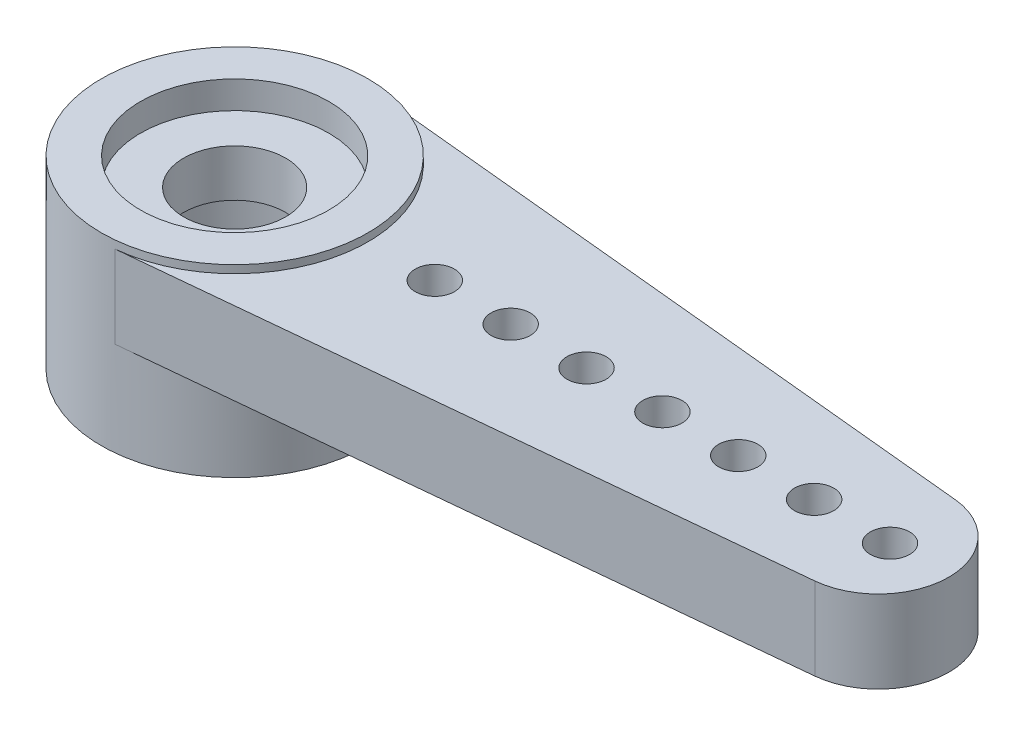
ISO-10303-21;
HEADER;
FILE_DESCRIPTION(('STEP AP214'),'2;1');
FILE_NAME('part.step','',(''),(''),'','','');
FILE_SCHEMA(('AUTOMOTIVE_DESIGN { 1 0 10303 214 1 1 1 1 }'));
ENDSEC;
DATA;
#1=APPLICATION_CONTEXT('core data for automotive mechanical design processes');
#2=APPLICATION_PROTOCOL_DEFINITION('international standard','automotive_design',2000,#1);
#3=PRODUCT_CONTEXT('',#1,'mechanical');
#4=PRODUCT('Part','Part','',(#3));
#5=PRODUCT_RELATED_PRODUCT_CATEGORY('part','',(#4));
#6=PRODUCT_DEFINITION_FORMATION('','',#4);
#7=PRODUCT_DEFINITION_CONTEXT('part definition',#1,'design');
#8=PRODUCT_DEFINITION('design','',#6,#7);
#9=PRODUCT_DEFINITION_SHAPE('','',#8);
#10=(LENGTH_UNIT() NAMED_UNIT(*) SI_UNIT(.MILLI.,.METRE.));
#11=(NAMED_UNIT(*) PLANE_ANGLE_UNIT() SI_UNIT($,.RADIAN.));
#12=(NAMED_UNIT(*) SI_UNIT($,.STERADIAN.) SOLID_ANGLE_UNIT());
#13=UNCERTAINTY_MEASURE_WITH_UNIT(LENGTH_MEASURE(1.E-05),#10,'distance_accuracy_value','');
#14=(GEOMETRIC_REPRESENTATION_CONTEXT(3) GLOBAL_UNCERTAINTY_ASSIGNED_CONTEXT((#13)) GLOBAL_UNIT_ASSIGNED_CONTEXT((#10,
#11,#12)) REPRESENTATION_CONTEXT('',''));
#15=CARTESIAN_POINT('',(0.,0.,0.));
#16=DIRECTION('',(0.,0.,1.));
#17=DIRECTION('',(1.,0.,0.));
#18=AXIS2_PLACEMENT_3D('',#15,#16,#17);
#19=CARTESIAN_POINT('',(30.,-0.200000000000001,0.));
#20=DIRECTION('',(0.,-1.,0.));
#21=DIRECTION('',(0.,0.,-1.));
#22=AXIS2_PLACEMENT_3D('',#19,#20,#21);
#23=PLANE('',#22);
#24=CARTESIAN_POINT('',(40.9,-0.200000000000001,0.));
#25=DIRECTION('',(0.,-1.,0.));
#26=DIRECTION('',(0.,0.,-1.));
#27=AXIS2_PLACEMENT_3D('',#24,#25,#26);
#28=CIRCLE('',#27,0.499999999999987);
#29=CARTESIAN_POINT('',(40.9,-0.200000000000001,-0.499999999999987));
#30=VERTEX_POINT('',#29);
#31=EDGE_CURVE('E214',#30,#30,#28,.T.);
#32=ORIENTED_EDGE('',*,*,#31,.T.);
#33=EDGE_LOOP('',(#32));
#34=FACE_BOUND('',#33,.T.);
#35=CARTESIAN_POINT('',(42.8333333333333,-0.200000000000001,0.));
#36=DIRECTION('',(0.,-1.,0.));
#37=DIRECTION('',(0.,0.,-1.));
#38=AXIS2_PLACEMENT_3D('',#35,#36,#37);
#39=CIRCLE('',#38,0.499999999999987);
#40=CARTESIAN_POINT('',(42.8333333333333,-0.200000000000001,-0.499999999999987));
#41=VERTEX_POINT('',#40);
#42=EDGE_CURVE('E208',#41,#41,#39,.T.);
#43=ORIENTED_EDGE('',*,*,#42,.T.);
#44=EDGE_LOOP('',(#43));
#45=FACE_BOUND('',#44,.T.);
#46=CARTESIAN_POINT('',(37.0333333333333,-0.200000000000001,0.));
#47=DIRECTION('',(0.,-1.,0.));
#48=DIRECTION('',(0.,0.,-1.));
#49=AXIS2_PLACEMENT_3D('',#46,#47,#48);
#50=CIRCLE('',#49,0.499999999999987);
#51=CARTESIAN_POINT('',(37.0333333333333,-0.200000000000001,-0.499999999999987));
#52=VERTEX_POINT('',#51);
#53=EDGE_CURVE('E202',#52,#52,#50,.T.);
#54=ORIENTED_EDGE('',*,*,#53,.T.);
#55=EDGE_LOOP('',(#54));
#56=FACE_BOUND('',#55,.T.);
#57=CARTESIAN_POINT('',(46.7,-0.200000000000001,0.));
#58=DIRECTION('',(0.,-1.,0.));
#59=DIRECTION('',(0.,0.,-1.));
#60=AXIS2_PLACEMENT_3D('',#57,#58,#59);
#61=CIRCLE('',#60,0.499999999999987);
#62=CARTESIAN_POINT('',(46.7,-0.200000000000001,-0.499999999999987));
#63=VERTEX_POINT('',#62);
#64=EDGE_CURVE('E196',#63,#63,#61,.T.);
#65=ORIENTED_EDGE('',*,*,#64,.T.);
#66=EDGE_LOOP('',(#65));
#67=FACE_BOUND('',#66,.T.);
#68=CARTESIAN_POINT('',(38.9666666666667,-0.200000000000001,0.));
#69=DIRECTION('',(0.,-1.,0.));
#70=DIRECTION('',(0.,0.,-1.));
#71=AXIS2_PLACEMENT_3D('',#68,#69,#70);
#72=CIRCLE('',#71,0.499999999999987);
#73=CARTESIAN_POINT('',(38.9666666666667,-0.200000000000001,-0.499999999999987));
#74=VERTEX_POINT('',#73);
#75=EDGE_CURVE('E190',#74,#74,#72,.T.);
#76=ORIENTED_EDGE('',*,*,#75,.T.);
#77=EDGE_LOOP('',(#76));
#78=FACE_BOUND('',#77,.T.);
#79=CARTESIAN_POINT('',(44.7666666666667,-0.200000000000001,0.));
#80=DIRECTION('',(0.,-1.,0.));
#81=DIRECTION('',(0.,0.,-1.));
#82=AXIS2_PLACEMENT_3D('',#79,#80,#81);
#83=CIRCLE('',#82,0.499999999999987);
#84=CARTESIAN_POINT('',(44.7666666666667,-0.200000000000001,-0.499999999999987));
#85=VERTEX_POINT('',#84);
#86=EDGE_CURVE('E184',#85,#85,#83,.T.);
#87=ORIENTED_EDGE('',*,*,#86,.T.);
#88=EDGE_LOOP('',(#87));
#89=FACE_BOUND('',#88,.T.);
#90=CARTESIAN_POINT('',(35.1,-0.200000000000001,0.));
#91=DIRECTION('',(0.,-1.,0.));
#92=DIRECTION('',(0.,0.,-1.));
#93=AXIS2_PLACEMENT_3D('',#90,#91,#92);
#94=CIRCLE('',#93,0.499999999999987);
#95=CARTESIAN_POINT('',(35.1,-0.200000000000001,-0.499999999999987));
#96=VERTEX_POINT('',#95);
#97=EDGE_CURVE('E178',#96,#96,#94,.T.);
#98=ORIENTED_EDGE('',*,*,#97,.T.);
#99=EDGE_LOOP('',(#98));
#100=FACE_BOUND('',#99,.T.);
#101=CARTESIAN_POINT('',(30.,-0.200000000000001,0.));
#102=DIRECTION('',(0.,1.,0.));
#103=DIRECTION('',(0.,0.,1.));
#104=AXIS2_PLACEMENT_3D('',#101,#102,#103);
#105=CIRCLE('',#104,3.4);
#106=CARTESIAN_POINT('',(30.3317073170732,-0.200000000000001,3.38378046802687));
#107=VERTEX_POINT('',#106);
#108=CARTESIAN_POINT('',(30.3317073170732,-0.200000000000001,-3.38378046802704));
#109=VERTEX_POINT('',#108);
#110=EDGE_CURVE('E90',#107,#109,#105,.T.);
#111=ORIENTED_EDGE('',*,*,#110,.F.);
#112=DIRECTION('',(0.995229549419667,0.,-0.0975609756097504));
#113=VECTOR('',#112,1.);
#114=CARTESIAN_POINT('',(46.5756097560976,-0.200000000000001,1.79141318895549));
#115=LINE('',#114,#113);
#116=CARTESIAN_POINT('',(46.5756097560976,-0.200000000000001,1.79141318895554));
#117=VERTEX_POINT('',#116);
#118=EDGE_CURVE('E83',#107,#117,#115,.T.);
#119=ORIENTED_EDGE('',*,*,#118,.T.);
#120=CARTESIAN_POINT('',(46.4,-0.200000000000001,0.));
#121=DIRECTION('',(0.,1.,0.));
#122=DIRECTION('',(0.,0.,-1.));
#123=AXIS2_PLACEMENT_3D('',#120,#121,#122);
#124=CIRCLE('',#123,1.80000000000014);
#125=CARTESIAN_POINT('',(46.5756097560976,-0.200000000000001,-1.79141318895558));
#126=VERTEX_POINT('',#125);
#127=EDGE_CURVE('E97',#117,#126,#124,.T.);
#128=ORIENTED_EDGE('',*,*,#127,.T.);
#129=DIRECTION('',(-0.995229549419667,0.,-0.0975609756097555));
#130=VECTOR('',#129,1.);
#131=CARTESIAN_POINT('',(30.3317073170732,-0.200000000000001,-3.38378046802704));
#132=LINE('',#131,#130);
#133=EDGE_CURVE('E62',#126,#109,#132,.T.);
#134=ORIENTED_EDGE('',*,*,#133,.T.);
#135=EDGE_LOOP('',(#111,#119,#128,#134));
#136=FACE_BOUND('',#135,.T.);
#137=ADVANCED_FACE('F39',(#34,#45,#56,#67,#78,#89,#100,#136),#23,.F.);
#138=CARTESIAN_POINT('',(30.,-2.3,0.));
#139=DIRECTION('',(0.,-1.,0.));
#140=DIRECTION('',(0.,0.,-1.));
#141=AXIS2_PLACEMENT_3D('',#138,#139,#140);
#142=CYLINDRICAL_SURFACE('',#141,3.4);
#143=CARTESIAN_POINT('',(30.,-2.3,0.));
#144=DIRECTION('',(0.,-1.,0.));
#145=DIRECTION('',(0.,0.,-1.));
#146=AXIS2_PLACEMENT_3D('',#143,#144,#145);
#147=CIRCLE('',#146,3.4);
#148=CARTESIAN_POINT('',(30.3317073170732,-2.3,-3.38378046802704));
#149=VERTEX_POINT('',#148);
#150=CARTESIAN_POINT('',(30.3317073170732,-2.3,3.38378046802687));
#151=VERTEX_POINT('',#150);
#152=EDGE_CURVE('E11',#149,#151,#147,.T.);
#153=ORIENTED_EDGE('',*,*,#152,.T.);
#154=DIRECTION('',(0.,-1.,0.));
#155=VECTOR('',#154,1.);
#156=CARTESIAN_POINT('',(30.3317073170732,-0.200000000000001,3.38378046802687));
#157=LINE('',#156,#155);
#158=EDGE_CURVE('E88',#107,#151,#157,.T.);
#159=ORIENTED_EDGE('',*,*,#158,.F.);
#160=ORIENTED_EDGE('',*,*,#110,.T.);
#161=DIRECTION('',(0.,-1.,0.));
#162=VECTOR('',#161,1.);
#163=CARTESIAN_POINT('',(30.3317073170732,-0.200000000000001,-3.38378046802704));
#164=LINE('',#163,#162);
#165=EDGE_CURVE('E53',#109,#149,#164,.T.);
#166=ORIENTED_EDGE('',*,*,#165,.T.);
#167=EDGE_LOOP('',(#153,#159,#160,#166));
#168=FACE_BOUND('',#167,.T.);
#169=CARTESIAN_POINT('',(30.,-4.7,0.));
#170=DIRECTION('',(0.,-1.,0.));
#171=DIRECTION('',(0.,0.,-1.));
#172=AXIS2_PLACEMENT_3D('',#169,#170,#171);
#173=CIRCLE('',#172,3.4);
#174=CARTESIAN_POINT('',(30.,-4.7,-3.4));
#175=VERTEX_POINT('',#174);
#176=EDGE_CURVE('E47',#175,#175,#173,.T.);
#177=ORIENTED_EDGE('',*,*,#176,.F.);
#178=EDGE_LOOP('',(#177));
#179=FACE_BOUND('',#178,.T.);
#180=CARTESIAN_POINT('',(30.,0.,0.));
#181=DIRECTION('',(0.,1.,0.));
#182=DIRECTION('',(0.,0.,1.));
#183=AXIS2_PLACEMENT_3D('',#180,#181,#182);
#184=CIRCLE('',#183,3.4);
#185=CARTESIAN_POINT('',(30.,0.,3.4));
#186=VERTEX_POINT('',#185);
#187=EDGE_CURVE('E100',#186,#186,#184,.T.);
#188=ORIENTED_EDGE('',*,*,#187,.F.);
#189=EDGE_LOOP('',(#188));
#190=FACE_BOUND('',#189,.T.);
#191=ADVANCED_FACE('F41',(#168,#179,#190),#142,.T.);
#192=CARTESIAN_POINT('',(30.,-4.7,0.));
#193=DIRECTION('',(0.,-1.,0.));
#194=DIRECTION('',(0.,0.,-1.));
#195=AXIS2_PLACEMENT_3D('',#192,#193,#194);
#196=PLANE('',#195);
#197=CARTESIAN_POINT('',(30.,-4.7,0.));
#198=DIRECTION('',(0.,-1.,0.));
#199=DIRECTION('',(0.,0.,-1.));
#200=AXIS2_PLACEMENT_3D('',#197,#198,#199);
#201=CIRCLE('',#200,2.4);
#202=CARTESIAN_POINT('',(30.,-4.7,-2.4));
#203=VERTEX_POINT('',#202);
#204=EDGE_CURVE('E107',#203,#203,#201,.T.);
#205=ORIENTED_EDGE('',*,*,#204,.F.);
#206=EDGE_LOOP('',(#205));
#207=FACE_BOUND('',#206,.T.);
#208=ORIENTED_EDGE('',*,*,#176,.T.);
#209=EDGE_LOOP('',(#208));
#210=FACE_BOUND('',#209,.T.);
#211=ADVANCED_FACE('F121',(#207,#210),#196,.T.);
#212=CARTESIAN_POINT('',(30.,-2.3,0.));
#213=DIRECTION('',(0.,-1.,0.));
#214=DIRECTION('',(0.,0.,-1.));
#215=AXIS2_PLACEMENT_3D('',#212,#213,#214);
#216=PLANE('',#215);
#217=CARTESIAN_POINT('',(40.9,-2.3,0.));
#218=DIRECTION('',(0.,-1.,0.));
#219=DIRECTION('',(0.,0.,-1.));
#220=AXIS2_PLACEMENT_3D('',#217,#218,#219);
#221=CIRCLE('',#220,0.499999999999987);
#222=CARTESIAN_POINT('',(40.9,-2.3,-0.499999999999987));
#223=VERTEX_POINT('',#222);
#224=EDGE_CURVE('E216',#223,#223,#221,.T.);
#225=ORIENTED_EDGE('',*,*,#224,.F.);
#226=EDGE_LOOP('',(#225));
#227=FACE_BOUND('',#226,.T.);
#228=CARTESIAN_POINT('',(42.8333333333333,-2.3,0.));
#229=DIRECTION('',(0.,-1.,0.));
#230=DIRECTION('',(0.,0.,-1.));
#231=AXIS2_PLACEMENT_3D('',#228,#229,#230);
#232=CIRCLE('',#231,0.499999999999987);
#233=CARTESIAN_POINT('',(42.8333333333333,-2.3,-0.499999999999987));
#234=VERTEX_POINT('',#233);
#235=EDGE_CURVE('E211',#234,#234,#232,.T.);
#236=ORIENTED_EDGE('',*,*,#235,.F.);
#237=EDGE_LOOP('',(#236));
#238=FACE_BOUND('',#237,.T.);
#239=CARTESIAN_POINT('',(37.0333333333333,-2.3,0.));
#240=DIRECTION('',(0.,-1.,0.));
#241=DIRECTION('',(0.,0.,-1.));
#242=AXIS2_PLACEMENT_3D('',#239,#240,#241);
#243=CIRCLE('',#242,0.499999999999987);
#244=CARTESIAN_POINT('',(37.0333333333333,-2.3,-0.499999999999987));
#245=VERTEX_POINT('',#244);
#246=EDGE_CURVE('E205',#245,#245,#243,.T.);
#247=ORIENTED_EDGE('',*,*,#246,.F.);
#248=EDGE_LOOP('',(#247));
#249=FACE_BOUND('',#248,.T.);
#250=CARTESIAN_POINT('',(46.7,-2.3,0.));
#251=DIRECTION('',(0.,-1.,0.));
#252=DIRECTION('',(0.,0.,-1.));
#253=AXIS2_PLACEMENT_3D('',#250,#251,#252);
#254=CIRCLE('',#253,0.499999999999987);
#255=CARTESIAN_POINT('',(46.7,-2.3,-0.499999999999987));
#256=VERTEX_POINT('',#255);
#257=EDGE_CURVE('E199',#256,#256,#254,.T.);
#258=ORIENTED_EDGE('',*,*,#257,.F.);
#259=EDGE_LOOP('',(#258));
#260=FACE_BOUND('',#259,.T.);
#261=CARTESIAN_POINT('',(38.9666666666667,-2.3,0.));
#262=DIRECTION('',(0.,-1.,0.));
#263=DIRECTION('',(0.,0.,-1.));
#264=AXIS2_PLACEMENT_3D('',#261,#262,#263);
#265=CIRCLE('',#264,0.499999999999987);
#266=CARTESIAN_POINT('',(38.9666666666667,-2.3,-0.499999999999987));
#267=VERTEX_POINT('',#266);
#268=EDGE_CURVE('E193',#267,#267,#265,.T.);
#269=ORIENTED_EDGE('',*,*,#268,.F.);
#270=EDGE_LOOP('',(#269));
#271=FACE_BOUND('',#270,.T.);
#272=CARTESIAN_POINT('',(44.7666666666667,-2.3,0.));
#273=DIRECTION('',(0.,-1.,0.));
#274=DIRECTION('',(0.,0.,-1.));
#275=AXIS2_PLACEMENT_3D('',#272,#273,#274);
#276=CIRCLE('',#275,0.499999999999987);
#277=CARTESIAN_POINT('',(44.7666666666667,-2.3,-0.499999999999987));
#278=VERTEX_POINT('',#277);
#279=EDGE_CURVE('E187',#278,#278,#276,.T.);
#280=ORIENTED_EDGE('',*,*,#279,.F.);
#281=EDGE_LOOP('',(#280));
#282=FACE_BOUND('',#281,.T.);
#283=CARTESIAN_POINT('',(35.1,-2.3,0.));
#284=DIRECTION('',(0.,-1.,0.));
#285=DIRECTION('',(0.,0.,-1.));
#286=AXIS2_PLACEMENT_3D('',#283,#284,#285);
#287=CIRCLE('',#286,0.499999999999987);
#288=CARTESIAN_POINT('',(35.1,-2.3,-0.499999999999987));
#289=VERTEX_POINT('',#288);
#290=EDGE_CURVE('E181',#289,#289,#287,.T.);
#291=ORIENTED_EDGE('',*,*,#290,.F.);
#292=EDGE_LOOP('',(#291));
#293=FACE_BOUND('',#292,.T.);
#294=ORIENTED_EDGE('',*,*,#152,.F.);
#295=DIRECTION('',(-0.995229549419667,0.,-0.0975609756097555));
#296=VECTOR('',#295,1.);
#297=CARTESIAN_POINT('',(30.3317073170732,-2.3,-3.38378046802704));
#298=LINE('',#297,#296);
#299=CARTESIAN_POINT('',(46.5756097560976,-2.3,-1.79141318895558));
#300=VERTEX_POINT('',#299);
#301=EDGE_CURVE('E98',#300,#149,#298,.T.);
#302=ORIENTED_EDGE('',*,*,#301,.F.);
#303=CARTESIAN_POINT('',(46.4,-2.3,0.));
#304=DIRECTION('',(0.,1.,0.));
#305=DIRECTION('',(0.,0.,-1.));
#306=AXIS2_PLACEMENT_3D('',#303,#304,#305);
#307=CIRCLE('',#306,1.80000000000014);
#308=CARTESIAN_POINT('',(46.5756097560976,-2.3,1.79141318895554));
#309=VERTEX_POINT('',#308);
#310=EDGE_CURVE('E79',#309,#300,#307,.T.);
#311=ORIENTED_EDGE('',*,*,#310,.F.);
#312=DIRECTION('',(0.995229549419667,0.,-0.0975609756097504));
#313=VECTOR('',#312,1.);
#314=CARTESIAN_POINT('',(46.5756097560976,-2.3,1.79141318895549));
#315=LINE('',#314,#313);
#316=EDGE_CURVE('E104',#151,#309,#315,.T.);
#317=ORIENTED_EDGE('',*,*,#316,.F.);
#318=EDGE_LOOP('',(#294,#302,#311,#317));
#319=FACE_BOUND('',#318,.T.);
#320=ADVANCED_FACE('F150',(#227,#238,#249,#260,#271,#282,#293,#319),#216,.T.);
#321=CARTESIAN_POINT('',(46.5756097560976,-0.200000000000001,1.79141318895549));
#322=DIRECTION('',(-0.0975609756097504,0.,-0.995229549419667));
#323=DIRECTION('',(-0.995229549419667,0.,0.0975609756097504));
#324=AXIS2_PLACEMENT_3D('',#321,#322,#323);
#325=PLANE('',#324);
#326=ORIENTED_EDGE('',*,*,#316,.T.);
#327=DIRECTION('',(0.,-1.,0.));
#328=VECTOR('',#327,1.);
#329=CARTESIAN_POINT('',(46.5756097560976,-0.200000000000001,1.79141318895554));
#330=LINE('',#329,#328);
#331=EDGE_CURVE('E93',#117,#309,#330,.T.);
#332=ORIENTED_EDGE('',*,*,#331,.F.);
#333=ORIENTED_EDGE('',*,*,#118,.F.);
#334=ORIENTED_EDGE('',*,*,#158,.T.);
#335=EDGE_LOOP('',(#326,#332,#333,#334));
#336=FACE_BOUND('',#335,.T.);
#337=ADVANCED_FACE('F95',(#336),#325,.F.);
#338=CARTESIAN_POINT('',(46.4,-0.200000000000001,0.));
#339=DIRECTION('',(0.,-1.,0.));
#340=DIRECTION('',(0.,0.,-1.));
#341=AXIS2_PLACEMENT_3D('',#338,#339,#340);
#342=CYLINDRICAL_SURFACE('',#341,1.80000000000014);
#343=ORIENTED_EDGE('',*,*,#310,.T.);
#344=DIRECTION('',(0.,-1.,0.));
#345=VECTOR('',#344,1.);
#346=CARTESIAN_POINT('',(46.5756097560976,-0.200000000000001,-1.79141318895558));
#347=LINE('',#346,#345);
#348=EDGE_CURVE('E116',#126,#300,#347,.T.);
#349=ORIENTED_EDGE('',*,*,#348,.F.);
#350=ORIENTED_EDGE('',*,*,#127,.F.);
#351=ORIENTED_EDGE('',*,*,#331,.T.);
#352=EDGE_LOOP('',(#343,#349,#350,#351));
#353=FACE_BOUND('',#352,.T.);
#354=ADVANCED_FACE('F139',(#353),#342,.T.);
#355=CARTESIAN_POINT('',(30.3317073170732,-0.200000000000001,-3.38378046802704));
#356=DIRECTION('',(-0.0975609756097556,0.,0.995229549419667));
#357=DIRECTION('',(0.995229549419667,0.,0.0975609756097556));
#358=AXIS2_PLACEMENT_3D('',#355,#356,#357);
#359=PLANE('',#358);
#360=ORIENTED_EDGE('',*,*,#301,.T.);
#361=ORIENTED_EDGE('',*,*,#165,.F.);
#362=ORIENTED_EDGE('',*,*,#133,.F.);
#363=ORIENTED_EDGE('',*,*,#348,.T.);
#364=EDGE_LOOP('',(#360,#361,#362,#363));
#365=FACE_BOUND('',#364,.T.);
#366=ADVANCED_FACE('F129',(#365),#359,.F.);
#367=CARTESIAN_POINT('',(30.,0.,0.));
#368=DIRECTION('',(0.,1.,0.));
#369=DIRECTION('',(0.,0.,1.));
#370=AXIS2_PLACEMENT_3D('',#367,#368,#369);
#371=PLANE('',#370);
#372=CARTESIAN_POINT('',(30.,0.,0.));
#373=DIRECTION('',(0.,-1.,0.));
#374=DIRECTION('',(0.,0.,-1.));
#375=AXIS2_PLACEMENT_3D('',#372,#373,#374);
#376=CIRCLE('',#375,2.4);
#377=CARTESIAN_POINT('',(30.,0.,-2.4));
#378=VERTEX_POINT('',#377);
#379=EDGE_CURVE('E101',#378,#378,#376,.T.);
#380=ORIENTED_EDGE('',*,*,#379,.T.);
#381=EDGE_LOOP('',(#380));
#382=FACE_BOUND('',#381,.T.);
#383=ORIENTED_EDGE('',*,*,#187,.T.);
#384=EDGE_LOOP('',(#383));
#385=FACE_BOUND('',#384,.T.);
#386=ADVANCED_FACE('F126',(#382,#385),#371,.T.);
#387=CARTESIAN_POINT('',(30.,0.,0.));
#388=DIRECTION('',(0.,-1.,0.));
#389=DIRECTION('',(0.,0.,-1.));
#390=AXIS2_PLACEMENT_3D('',#387,#388,#389);
#391=CYLINDRICAL_SURFACE('',#390,2.4);
#392=ORIENTED_EDGE('',*,*,#379,.F.);
#393=EDGE_LOOP('',(#392));
#394=FACE_BOUND('',#393,.T.);
#395=CARTESIAN_POINT('',(30.,-0.7,0.));
#396=DIRECTION('',(0.,-1.,0.));
#397=DIRECTION('',(0.,0.,-1.));
#398=AXIS2_PLACEMENT_3D('',#395,#396,#397);
#399=CIRCLE('',#398,2.4);
#400=CARTESIAN_POINT('',(30.,-0.7,-2.4));
#401=VERTEX_POINT('',#400);
#402=EDGE_CURVE('E175',#401,#401,#399,.T.);
#403=ORIENTED_EDGE('',*,*,#402,.T.);
#404=EDGE_LOOP('',(#403));
#405=FACE_BOUND('',#404,.T.);
#406=ADVANCED_FACE('F128',(#394,#405),#391,.F.);
#407=CARTESIAN_POINT('',(30.,0.,0.));
#408=DIRECTION('',(0.,-1.,0.));
#409=DIRECTION('',(0.,0.,-1.));
#410=AXIS2_PLACEMENT_3D('',#407,#408,#409);
#411=CYLINDRICAL_SURFACE('',#410,2.4);
#412=CARTESIAN_POINT('',(30.,-1.9,0.));
#413=DIRECTION('',(0.,-1.,0.));
#414=DIRECTION('',(0.,0.,-1.));
#415=AXIS2_PLACEMENT_3D('',#412,#413,#414);
#416=CIRCLE('',#415,2.4);
#417=CARTESIAN_POINT('',(30.,-1.9,-2.4));
#418=VERTEX_POINT('',#417);
#419=EDGE_CURVE('E164',#418,#418,#416,.T.);
#420=ORIENTED_EDGE('',*,*,#419,.F.);
#421=EDGE_LOOP('',(#420));
#422=FACE_BOUND('',#421,.T.);
#423=ORIENTED_EDGE('',*,*,#204,.T.);
#424=EDGE_LOOP('',(#423));
#425=FACE_BOUND('',#424,.T.);
#426=ADVANCED_FACE('F136',(#422,#425),#411,.F.);
#427=CARTESIAN_POINT('',(32.4,-1.9,0.));
#428=DIRECTION('',(0.,1.,0.));
#429=DIRECTION('',(0.,0.,1.));
#430=AXIS2_PLACEMENT_3D('',#427,#428,#429);
#431=PLANE('',#430);
#432=CARTESIAN_POINT('',(30.,-1.9,0.));
#433=DIRECTION('',(0.,-1.,0.));
#434=DIRECTION('',(0.,0.,-1.));
#435=AXIS2_PLACEMENT_3D('',#432,#433,#434);
#436=CIRCLE('',#435,1.3);
#437=CARTESIAN_POINT('',(30.,-1.9,-1.3));
#438=VERTEX_POINT('',#437);
#439=EDGE_CURVE('E167',#438,#438,#436,.T.);
#440=ORIENTED_EDGE('',*,*,#439,.F.);
#441=EDGE_LOOP('',(#440));
#442=FACE_BOUND('',#441,.T.);
#443=ORIENTED_EDGE('',*,*,#419,.T.);
#444=EDGE_LOOP('',(#443));
#445=FACE_BOUND('',#444,.T.);
#446=ADVANCED_FACE('F259',(#442,#445),#431,.F.);
#447=CARTESIAN_POINT('',(30.,0.,0.));
#448=DIRECTION('',(0.,-1.,0.));
#449=DIRECTION('',(0.,0.,-1.));
#450=AXIS2_PLACEMENT_3D('',#447,#448,#449);
#451=CYLINDRICAL_SURFACE('',#450,1.3);
#452=CARTESIAN_POINT('',(30.,-0.7,0.));
#453=DIRECTION('',(0.,-1.,0.));
#454=DIRECTION('',(0.,0.,-1.));
#455=AXIS2_PLACEMENT_3D('',#452,#453,#454);
#456=CIRCLE('',#455,1.3);
#457=CARTESIAN_POINT('',(30.,-0.7,-1.3));
#458=VERTEX_POINT('',#457);
#459=EDGE_CURVE('E172',#458,#458,#456,.T.);
#460=ORIENTED_EDGE('',*,*,#459,.F.);
#461=EDGE_LOOP('',(#460));
#462=FACE_BOUND('',#461,.T.);
#463=ORIENTED_EDGE('',*,*,#439,.T.);
#464=EDGE_LOOP('',(#463));
#465=FACE_BOUND('',#464,.T.);
#466=ADVANCED_FACE('F252',(#462,#465),#451,.F.);
#467=CARTESIAN_POINT('',(31.3,-0.7,0.));
#468=DIRECTION('',(0.,-1.,0.));
#469=DIRECTION('',(0.,0.,-1.));
#470=AXIS2_PLACEMENT_3D('',#467,#468,#469);
#471=PLANE('',#470);
#472=ORIENTED_EDGE('',*,*,#402,.F.);
#473=EDGE_LOOP('',(#472));
#474=FACE_BOUND('',#473,.T.);
#475=ORIENTED_EDGE('',*,*,#459,.T.);
#476=EDGE_LOOP('',(#475));
#477=FACE_BOUND('',#476,.T.);
#478=ADVANCED_FACE('F241',(#474,#477),#471,.F.);
#479=CARTESIAN_POINT('',(35.1,-2.3,0.));
#480=DIRECTION('',(0.,-1.,0.));
#481=DIRECTION('',(0.,0.,-1.));
#482=AXIS2_PLACEMENT_3D('',#479,#480,#481);
#483=CYLINDRICAL_SURFACE('',#482,0.499999999999987);
#484=ORIENTED_EDGE('',*,*,#290,.T.);
#485=EDGE_LOOP('',(#484));
#486=FACE_BOUND('',#485,.T.);
#487=ORIENTED_EDGE('',*,*,#97,.F.);
#488=EDGE_LOOP('',(#487));
#489=FACE_BOUND('',#488,.T.);
#490=ADVANCED_FACE('F237',(#486,#489),#483,.F.);
#491=CARTESIAN_POINT('',(44.7666666666667,-2.3,0.));
#492=DIRECTION('',(0.,-1.,0.));
#493=DIRECTION('',(0.,0.,-1.));
#494=AXIS2_PLACEMENT_3D('',#491,#492,#493);
#495=CYLINDRICAL_SURFACE('',#494,0.499999999999987);
#496=ORIENTED_EDGE('',*,*,#279,.T.);
#497=EDGE_LOOP('',(#496));
#498=FACE_BOUND('',#497,.T.);
#499=ORIENTED_EDGE('',*,*,#86,.F.);
#500=EDGE_LOOP('',(#499));
#501=FACE_BOUND('',#500,.T.);
#502=ADVANCED_FACE('F240',(#498,#501),#495,.F.);
#503=CARTESIAN_POINT('',(38.9666666666667,-2.3,0.));
#504=DIRECTION('',(0.,-1.,0.));
#505=DIRECTION('',(0.,0.,-1.));
#506=AXIS2_PLACEMENT_3D('',#503,#504,#505);
#507=CYLINDRICAL_SURFACE('',#506,0.499999999999987);
#508=ORIENTED_EDGE('',*,*,#268,.T.);
#509=EDGE_LOOP('',(#508));
#510=FACE_BOUND('',#509,.T.);
#511=ORIENTED_EDGE('',*,*,#75,.F.);
#512=EDGE_LOOP('',(#511));
#513=FACE_BOUND('',#512,.T.);
#514=ADVANCED_FACE('F249',(#510,#513),#507,.F.);
#515=CARTESIAN_POINT('',(46.7,-2.3,0.));
#516=DIRECTION('',(0.,-1.,0.));
#517=DIRECTION('',(0.,0.,-1.));
#518=AXIS2_PLACEMENT_3D('',#515,#516,#517);
#519=CYLINDRICAL_SURFACE('',#518,0.499999999999987);
#520=ORIENTED_EDGE('',*,*,#257,.T.);
#521=EDGE_LOOP('',(#520));
#522=FACE_BOUND('',#521,.T.);
#523=ORIENTED_EDGE('',*,*,#64,.F.);
#524=EDGE_LOOP('',(#523));
#525=FACE_BOUND('',#524,.T.);
#526=ADVANCED_FACE('F321',(#522,#525),#519,.F.);
#527=CARTESIAN_POINT('',(37.0333333333333,-2.3,0.));
#528=DIRECTION('',(0.,-1.,0.));
#529=DIRECTION('',(0.,0.,-1.));
#530=AXIS2_PLACEMENT_3D('',#527,#528,#529);
#531=CYLINDRICAL_SURFACE('',#530,0.499999999999987);
#532=ORIENTED_EDGE('',*,*,#246,.T.);
#533=EDGE_LOOP('',(#532));
#534=FACE_BOUND('',#533,.T.);
#535=ORIENTED_EDGE('',*,*,#53,.F.);
#536=EDGE_LOOP('',(#535));
#537=FACE_BOUND('',#536,.T.);
#538=ADVANCED_FACE('F331',(#534,#537),#531,.F.);
#539=CARTESIAN_POINT('',(42.8333333333333,-2.3,0.));
#540=DIRECTION('',(0.,-1.,0.));
#541=DIRECTION('',(0.,0.,-1.));
#542=AXIS2_PLACEMENT_3D('',#539,#540,#541);
#543=CYLINDRICAL_SURFACE('',#542,0.499999999999987);
#544=ORIENTED_EDGE('',*,*,#235,.T.);
#545=EDGE_LOOP('',(#544));
#546=FACE_BOUND('',#545,.T.);
#547=ORIENTED_EDGE('',*,*,#42,.F.);
#548=EDGE_LOOP('',(#547));
#549=FACE_BOUND('',#548,.T.);
#550=ADVANCED_FACE('F342',(#546,#549),#543,.F.);
#551=CARTESIAN_POINT('',(40.9,-2.3,0.));
#552=DIRECTION('',(0.,-1.,0.));
#553=DIRECTION('',(0.,0.,-1.));
#554=AXIS2_PLACEMENT_3D('',#551,#552,#553);
#555=CYLINDRICAL_SURFACE('',#554,0.499999999999987);
#556=ORIENTED_EDGE('',*,*,#224,.T.);
#557=EDGE_LOOP('',(#556));
#558=FACE_BOUND('',#557,.T.);
#559=ORIENTED_EDGE('',*,*,#31,.F.);
#560=EDGE_LOOP('',(#559));
#561=FACE_BOUND('',#560,.T.);
#562=ADVANCED_FACE('F220',(#558,#561),#555,.F.);
#563=CLOSED_SHELL('',(#137,#191,#211,#320,#337,#354,#366,#386,#406,#426,#446,#466,#478,#490,
#502,#514,#526,#538,#550,#562));
#564=MANIFOLD_SOLID_BREP('B2',#563);
#565=ADVANCED_BREP_SHAPE_REPRESENTATION('',(#18,#564),#14);
#566=SHAPE_DEFINITION_REPRESENTATION(#9,#565);
ENDSEC;
END-ISO-10303-21;
